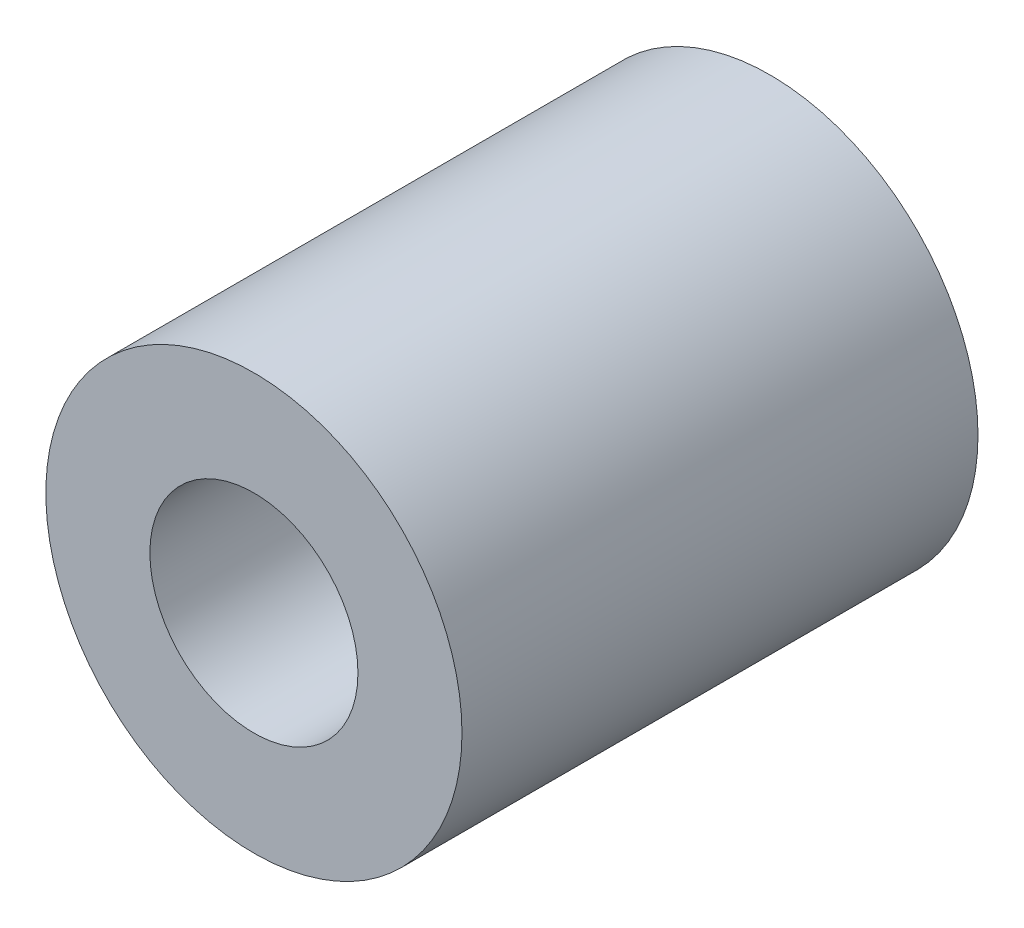
ISO-10303-21;
HEADER;
FILE_DESCRIPTION(('STEP AP214'),'2;1');
FILE_NAME('part.step','',(''),(''),'','','');
FILE_SCHEMA(('AUTOMOTIVE_DESIGN { 1 0 10303 214 1 1 1 1 }'));
ENDSEC;
DATA;
#1=APPLICATION_CONTEXT('core data for automotive mechanical design processes');
#2=APPLICATION_PROTOCOL_DEFINITION('international standard','automotive_design',2000,#1);
#3=PRODUCT_CONTEXT('',#1,'mechanical');
#4=PRODUCT('Part','Part','',(#3));
#5=PRODUCT_RELATED_PRODUCT_CATEGORY('part','',(#4));
#6=PRODUCT_DEFINITION_FORMATION('','',#4);
#7=PRODUCT_DEFINITION_CONTEXT('part definition',#1,'design');
#8=PRODUCT_DEFINITION('design','',#6,#7);
#9=PRODUCT_DEFINITION_SHAPE('','',#8);
#10=(LENGTH_UNIT() NAMED_UNIT(*) SI_UNIT(.MILLI.,.METRE.));
#11=(NAMED_UNIT(*) PLANE_ANGLE_UNIT() SI_UNIT($,.RADIAN.));
#12=(NAMED_UNIT(*) SI_UNIT($,.STERADIAN.) SOLID_ANGLE_UNIT());
#13=UNCERTAINTY_MEASURE_WITH_UNIT(LENGTH_MEASURE(1.E-05),#10,'distance_accuracy_value','');
#14=(GEOMETRIC_REPRESENTATION_CONTEXT(3) GLOBAL_UNCERTAINTY_ASSIGNED_CONTEXT((#13)) GLOBAL_UNIT_ASSIGNED_CONTEXT((#10,
#11,#12)) REPRESENTATION_CONTEXT('',''));
#15=CARTESIAN_POINT('',(0.,0.,0.));
#16=DIRECTION('',(0.,0.,1.));
#17=DIRECTION('',(1.,0.,0.));
#18=AXIS2_PLACEMENT_3D('',#15,#16,#17);
#19=CARTESIAN_POINT('',(0.,0.,7.874));
#20=DIRECTION('',(0.,0.,1.));
#21=DIRECTION('',(1.,0.,0.));
#22=AXIS2_PLACEMENT_3D('',#19,#20,#21);
#23=PLANE('',#22);
#24=CARTESIAN_POINT('',(0.,0.,7.874));
#25=DIRECTION('',(0.,0.,1.));
#26=DIRECTION('',(1.,0.,0.));
#27=AXIS2_PLACEMENT_3D('',#24,#25,#26);
#28=CIRCLE('',#27,6.35);
#29=CARTESIAN_POINT('',(6.35,0.,7.874));
#30=VERTEX_POINT('',#29);
#31=EDGE_CURVE('E10',#30,#30,#28,.T.);
#32=ORIENTED_EDGE('',*,*,#31,.T.);
#33=EDGE_LOOP('',(#32));
#34=FACE_BOUND('',#33,.T.);
#35=CARTESIAN_POINT('',(0.,0.,7.874));
#36=DIRECTION('',(0.,0.,1.));
#37=DIRECTION('',(1.,0.,0.));
#38=AXIS2_PLACEMENT_3D('',#35,#36,#37);
#39=CIRCLE('',#38,3.175);
#40=CARTESIAN_POINT('',(3.175,0.,7.874));
#41=VERTEX_POINT('',#40);
#42=EDGE_CURVE('E42',#41,#41,#39,.T.);
#43=ORIENTED_EDGE('',*,*,#42,.F.);
#44=EDGE_LOOP('',(#43));
#45=FACE_BOUND('',#44,.T.);
#46=ADVANCED_FACE('F31',(#34,#45),#23,.T.);
#47=CARTESIAN_POINT('',(0.,0.,-7.874));
#48=DIRECTION('',(0.,0.,1.));
#49=DIRECTION('',(1.,0.,0.));
#50=AXIS2_PLACEMENT_3D('',#47,#48,#49);
#51=PLANE('',#50);
#52=CARTESIAN_POINT('',(0.,0.,-7.874));
#53=DIRECTION('',(0.,0.,1.));
#54=DIRECTION('',(1.,0.,0.));
#55=AXIS2_PLACEMENT_3D('',#52,#53,#54);
#56=CIRCLE('',#55,6.35);
#57=CARTESIAN_POINT('',(6.35,0.,-7.874));
#58=VERTEX_POINT('',#57);
#59=EDGE_CURVE('E35',#58,#58,#56,.T.);
#60=ORIENTED_EDGE('',*,*,#59,.F.);
#61=EDGE_LOOP('',(#60));
#62=FACE_BOUND('',#61,.T.);
#63=CARTESIAN_POINT('',(0.,0.,-7.874));
#64=DIRECTION('',(0.,0.,1.));
#65=DIRECTION('',(1.,0.,0.));
#66=AXIS2_PLACEMENT_3D('',#63,#64,#65);
#67=CIRCLE('',#66,3.175);
#68=CARTESIAN_POINT('',(3.175,0.,-7.874));
#69=VERTEX_POINT('',#68);
#70=EDGE_CURVE('E44',#69,#69,#67,.T.);
#71=ORIENTED_EDGE('',*,*,#70,.T.);
#72=EDGE_LOOP('',(#71));
#73=FACE_BOUND('',#72,.T.);
#74=ADVANCED_FACE('F54',(#62,#73),#51,.F.);
#75=CARTESIAN_POINT('',(0.,0.,7.874));
#76=DIRECTION('',(0.,0.,-1.));
#77=DIRECTION('',(-1.,0.,0.));
#78=AXIS2_PLACEMENT_3D('',#75,#76,#77);
#79=CYLINDRICAL_SURFACE('',#78,6.35);
#80=ORIENTED_EDGE('',*,*,#31,.F.);
#81=EDGE_LOOP('',(#80));
#82=FACE_BOUND('',#81,.T.);
#83=ORIENTED_EDGE('',*,*,#59,.T.);
#84=EDGE_LOOP('',(#83));
#85=FACE_BOUND('',#84,.T.);
#86=ADVANCED_FACE('F33',(#82,#85),#79,.T.);
#87=CARTESIAN_POINT('',(0.,0.,7.874));
#88=DIRECTION('',(0.,0.,-1.));
#89=DIRECTION('',(-1.,0.,0.));
#90=AXIS2_PLACEMENT_3D('',#87,#88,#89);
#91=CYLINDRICAL_SURFACE('',#90,3.175);
#92=ORIENTED_EDGE('',*,*,#42,.T.);
#93=EDGE_LOOP('',(#92));
#94=FACE_BOUND('',#93,.T.);
#95=ORIENTED_EDGE('',*,*,#70,.F.);
#96=EDGE_LOOP('',(#95));
#97=FACE_BOUND('',#96,.T.);
#98=ADVANCED_FACE('F50',(#94,#97),#91,.F.);
#99=CLOSED_SHELL('',(#46,#74,#86,#98));
#100=MANIFOLD_SOLID_BREP('B2',#99);
#101=ADVANCED_BREP_SHAPE_REPRESENTATION('',(#18,#100),#14);
#102=SHAPE_DEFINITION_REPRESENTATION(#9,#101);
ENDSEC;
END-ISO-10303-21;
